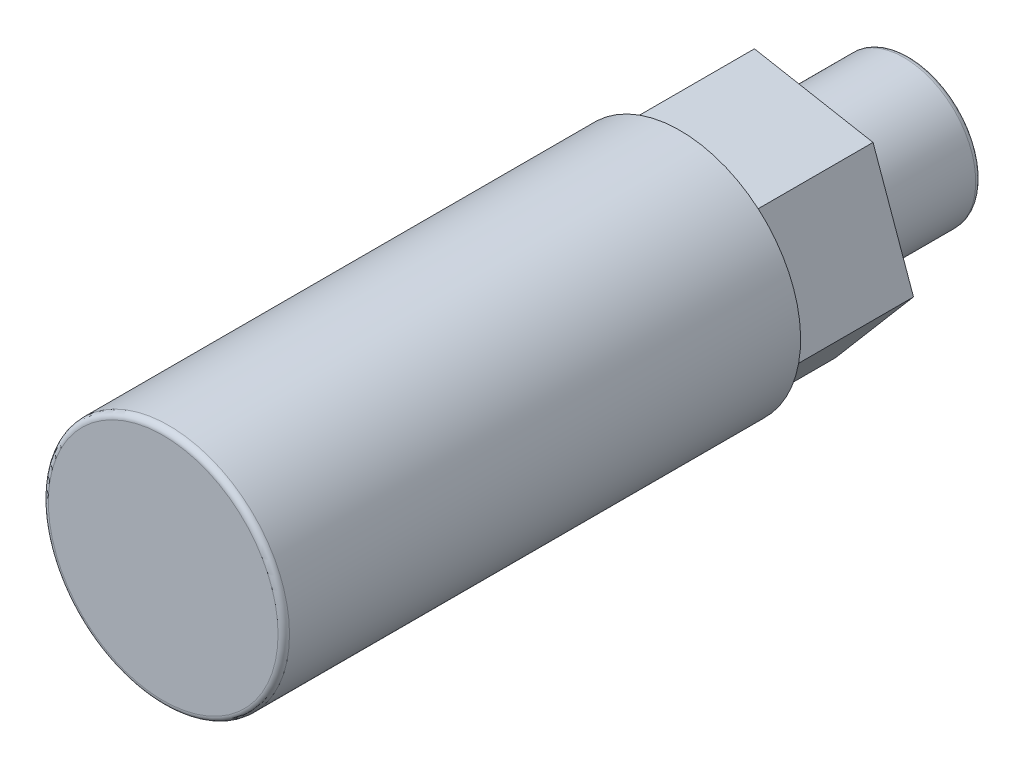
ISO-10303-21;
HEADER;
FILE_DESCRIPTION(('STEP AP214'),'2;1');
FILE_NAME('part.step','',(''),(''),'','','');
FILE_SCHEMA(('AUTOMOTIVE_DESIGN { 1 0 10303 214 1 1 1 1 }'));
ENDSEC;
DATA;
#1=APPLICATION_CONTEXT('core data for automotive mechanical design processes');
#2=APPLICATION_PROTOCOL_DEFINITION('international standard','automotive_design',2000,#1);
#3=PRODUCT_CONTEXT('',#1,'mechanical');
#4=PRODUCT('Part','Part','',(#3));
#5=PRODUCT_RELATED_PRODUCT_CATEGORY('part','',(#4));
#6=PRODUCT_DEFINITION_FORMATION('','',#4);
#7=PRODUCT_DEFINITION_CONTEXT('part definition',#1,'design');
#8=PRODUCT_DEFINITION('design','',#6,#7);
#9=PRODUCT_DEFINITION_SHAPE('','',#8);
#10=(LENGTH_UNIT() NAMED_UNIT(*) SI_UNIT(.MILLI.,.METRE.));
#11=(NAMED_UNIT(*) PLANE_ANGLE_UNIT() SI_UNIT($,.RADIAN.));
#12=(NAMED_UNIT(*) SI_UNIT($,.STERADIAN.) SOLID_ANGLE_UNIT());
#13=UNCERTAINTY_MEASURE_WITH_UNIT(LENGTH_MEASURE(1.E-05),#10,'distance_accuracy_value','');
#14=(GEOMETRIC_REPRESENTATION_CONTEXT(3) GLOBAL_UNCERTAINTY_ASSIGNED_CONTEXT((#13)) GLOBAL_UNIT_ASSIGNED_CONTEXT((#10,
#11,#12)) REPRESENTATION_CONTEXT('',''));
#15=CARTESIAN_POINT('',(0.,0.,0.));
#16=DIRECTION('',(0.,0.,1.));
#17=DIRECTION('',(1.,0.,0.));
#18=AXIS2_PLACEMENT_3D('',#15,#16,#17);
#19=CARTESIAN_POINT('',(-6.80524025575274,-7.99616814864985,-10.));
#20=DIRECTION('',(0.,0.,-1.));
#21=DIRECTION('',(-1.,0.,0.));
#22=AXIS2_PLACEMENT_3D('',#19,#20,#21);
#23=PLANE('',#22);
#24=DIRECTION('',(-0.983571893098964,0.180516844382234,0.));
#25=VECTOR('',#24,1.);
#26=CARTESIAN_POINT('',(3.52226462178638,-9.8915950146633,-10.));
#27=LINE('',#26,#25);
#28=CARTESIAN_POINT('',(3.52226462178638,-9.8915950146633,-10.));
#29=VERTEX_POINT('',#28);
#30=CARTESIAN_POINT('',(-6.80524025575274,-7.99616814864985,-10.));
#31=VERTEX_POINT('',#30);
#32=EDGE_CURVE('E97',#29,#31,#27,.T.);
#33=ORIENTED_EDGE('',*,*,#32,.T.);
#34=DIRECTION('',(-0.335453773503465,0.942056668063172,0.));
#35=VECTOR('',#34,1.);
#36=CARTESIAN_POINT('',(-6.80524025575274,-7.99616814864985,-10.));
#37=LINE('',#36,#35);
#38=CARTESIAN_POINT('',(-10.3275048775391,1.89542686601346,-10.));
#39=VERTEX_POINT('',#38);
#40=EDGE_CURVE('E86',#31,#39,#37,.T.);
#41=ORIENTED_EDGE('',*,*,#40,.T.);
#42=DIRECTION('',(0.648118119595499,0.761539823680938,0.));
#43=VECTOR('',#42,1.);
#44=CARTESIAN_POINT('',(-10.3275048775391,1.89542686601346,-10.));
#45=LINE('',#44,#43);
#46=CARTESIAN_POINT('',(-3.52226462178638,9.8915950146633,-10.));
#47=VERTEX_POINT('',#46);
#48=EDGE_CURVE('E96',#39,#47,#45,.T.);
#49=ORIENTED_EDGE('',*,*,#48,.T.);
#50=DIRECTION('',(0.983571893098964,-0.180516844382234,0.));
#51=VECTOR('',#50,1.);
#52=CARTESIAN_POINT('',(-3.52226462178638,9.8915950146633,-10.));
#53=LINE('',#52,#51);
#54=CARTESIAN_POINT('',(6.80524025575273,7.99616814864985,-10.));
#55=VERTEX_POINT('',#54);
#56=EDGE_CURVE('E209',#47,#55,#53,.T.);
#57=ORIENTED_EDGE('',*,*,#56,.T.);
#58=DIRECTION('',(0.335453773503465,-0.942056668063172,0.));
#59=VECTOR('',#58,1.);
#60=CARTESIAN_POINT('',(6.80524025575273,7.99616814864985,-10.));
#61=LINE('',#60,#59);
#62=CARTESIAN_POINT('',(10.3275048775391,-1.89542686601346,-10.));
#63=VERTEX_POINT('',#62);
#64=EDGE_CURVE('E227',#55,#63,#61,.T.);
#65=ORIENTED_EDGE('',*,*,#64,.T.);
#66=DIRECTION('',(-0.648118119595499,-0.761539823680938,0.));
#67=VECTOR('',#66,1.);
#68=CARTESIAN_POINT('',(10.3275048775391,-1.89542686601346,-10.));
#69=LINE('',#68,#67);
#70=EDGE_CURVE('E102',#63,#29,#69,.T.);
#71=ORIENTED_EDGE('',*,*,#70,.T.);
#72=EDGE_LOOP('',(#33,#41,#49,#57,#65,#71));
#73=FACE_BOUND('',#72,.T.);
#74=CARTESIAN_POINT('',(0.,0.,-10.));
#75=DIRECTION('',(0.,0.,-1.));
#76=DIRECTION('',(-1.,0.,0.));
#77=AXIS2_PLACEMENT_3D('',#74,#75,#76);
#78=CIRCLE('',#77,6.25);
#79=CARTESIAN_POINT('',(-6.25,0.,-10.));
#80=VERTEX_POINT('',#79);
#81=EDGE_CURVE('E225',#80,#80,#78,.T.);
#82=ORIENTED_EDGE('',*,*,#81,.F.);
#83=EDGE_LOOP('',(#82));
#84=FACE_BOUND('',#83,.T.);
#85=ADVANCED_FACE('F32',(#73,#84),#23,.T.);
#86=CARTESIAN_POINT('',(0.,0.,0.));
#87=DIRECTION('',(0.,0.,1.));
#88=DIRECTION('',(1.,0.,0.));
#89=AXIS2_PLACEMENT_3D('',#86,#87,#88);
#90=PLANE('',#89);
#91=DIRECTION('',(-0.983571893098964,0.180516844382234,0.));
#92=VECTOR('',#91,1.);
#93=CARTESIAN_POINT('',(3.52226462178638,-9.8915950146633,0.));
#94=LINE('',#93,#92);
#95=CARTESIAN_POINT('',(3.52226462178637,-9.89159501466331,0.));
#96=VERTEX_POINT('',#95);
#97=CARTESIAN_POINT('',(-6.80524025575273,-7.99616814864986,0.));
#98=VERTEX_POINT('',#97);
#99=EDGE_CURVE('E53',#96,#98,#94,.T.);
#100=ORIENTED_EDGE('',*,*,#99,.F.);
#101=CARTESIAN_POINT('',(0.,0.,0.));
#102=DIRECTION('',(0.,0.,1.));
#103=DIRECTION('',(1.,0.,0.));
#104=AXIS2_PLACEMENT_3D('',#101,#102,#103);
#105=CIRCLE('',#104,10.5);
#106=EDGE_CURVE('E376',#98,#96,#105,.T.);
#107=ORIENTED_EDGE('',*,*,#106,.F.);
#108=EDGE_LOOP('',(#100,#107));
#109=FACE_BOUND('',#108,.T.);
#110=ADVANCED_FACE('F144',(#109),#90,.F.);
#111=DIRECTION('',(-0.648118119595499,-0.761539823680938,0.));
#112=VECTOR('',#111,1.);
#113=CARTESIAN_POINT('',(10.3275048775391,-1.89542686601346,0.));
#114=LINE('',#113,#112);
#115=CARTESIAN_POINT('',(10.3275048775391,-1.89542686601347,0.));
#116=VERTEX_POINT('',#115);
#117=EDGE_CURVE('E46',#116,#96,#114,.T.);
#118=ORIENTED_EDGE('',*,*,#117,.F.);
#119=EDGE_CURVE('E111',#96,#116,#105,.T.);
#120=ORIENTED_EDGE('',*,*,#119,.F.);
#121=EDGE_LOOP('',(#118,#120));
#122=FACE_BOUND('',#121,.T.);
#123=ADVANCED_FACE('F149',(#122),#90,.F.);
#124=DIRECTION('',(0.335453773503465,-0.942056668063172,0.));
#125=VECTOR('',#124,1.);
#126=CARTESIAN_POINT('',(6.80524025575273,7.99616814864985,0.));
#127=LINE('',#126,#125);
#128=CARTESIAN_POINT('',(6.80524025575275,7.99616814864984,0.));
#129=VERTEX_POINT('',#128);
#130=EDGE_CURVE('E219',#129,#116,#127,.T.);
#131=ORIENTED_EDGE('',*,*,#130,.F.);
#132=EDGE_CURVE('E108',#116,#129,#105,.T.);
#133=ORIENTED_EDGE('',*,*,#132,.F.);
#134=EDGE_LOOP('',(#131,#133));
#135=FACE_BOUND('',#134,.T.);
#136=ADVANCED_FACE('F350',(#135),#90,.F.);
#137=DIRECTION('',(0.983571893098964,-0.180516844382234,0.));
#138=VECTOR('',#137,1.);
#139=CARTESIAN_POINT('',(-3.52226462178638,9.8915950146633,0.));
#140=LINE('',#139,#138);
#141=CARTESIAN_POINT('',(-3.52226462178637,9.89159501466331,0.));
#142=VERTEX_POINT('',#141);
#143=EDGE_CURVE('E204',#142,#129,#140,.T.);
#144=ORIENTED_EDGE('',*,*,#143,.F.);
#145=EDGE_CURVE('E113',#129,#142,#105,.T.);
#146=ORIENTED_EDGE('',*,*,#145,.F.);
#147=EDGE_LOOP('',(#144,#146));
#148=FACE_BOUND('',#147,.T.);
#149=ADVANCED_FACE('F342',(#148),#90,.F.);
#150=DIRECTION('',(0.648118119595499,0.761539823680938,0.));
#151=VECTOR('',#150,1.);
#152=CARTESIAN_POINT('',(-10.3275048775391,1.89542686601346,0.));
#153=LINE('',#152,#151);
#154=CARTESIAN_POINT('',(-10.3275048775391,1.89542686601346,0.));
#155=VERTEX_POINT('',#154);
#156=EDGE_CURVE('E200',#155,#142,#153,.T.);
#157=ORIENTED_EDGE('',*,*,#156,.F.);
#158=EDGE_CURVE('E120',#142,#155,#105,.T.);
#159=ORIENTED_EDGE('',*,*,#158,.F.);
#160=EDGE_LOOP('',(#157,#159));
#161=FACE_BOUND('',#160,.T.);
#162=ADVANCED_FACE('F186',(#161),#90,.F.);
#163=DIRECTION('',(-0.335453773503465,0.942056668063172,0.));
#164=VECTOR('',#163,1.);
#165=CARTESIAN_POINT('',(-6.80524025575274,-7.99616814864985,0.));
#166=LINE('',#165,#164);
#167=EDGE_CURVE('E205',#98,#155,#166,.T.);
#168=ORIENTED_EDGE('',*,*,#167,.F.);
#169=EDGE_CURVE('E377',#155,#98,#105,.T.);
#170=ORIENTED_EDGE('',*,*,#169,.F.);
#171=EDGE_LOOP('',(#168,#170));
#172=FACE_BOUND('',#171,.T.);
#173=ADVANCED_FACE('F151',(#172),#90,.F.);
#174=CARTESIAN_POINT('',(0.,0.,45.));
#175=DIRECTION('',(0.,0.,-1.));
#176=DIRECTION('',(-1.,0.,0.));
#177=AXIS2_PLACEMENT_3D('',#174,#175,#176);
#178=CYLINDRICAL_SURFACE('',#177,10.5);
#179=CARTESIAN_POINT('',(0.,0.,44.5));
#180=DIRECTION('',(0.,0.,1.));
#181=DIRECTION('',(1.,0.,0.));
#182=AXIS2_PLACEMENT_3D('',#179,#180,#181);
#183=CIRCLE('',#182,10.5);
#184=CARTESIAN_POINT('',(10.5,0.,44.5));
#185=VERTEX_POINT('',#184);
#186=EDGE_CURVE('E123',#185,#185,#183,.F.);
#187=ORIENTED_EDGE('',*,*,#186,.T.);
#188=EDGE_LOOP('',(#187));
#189=FACE_BOUND('',#188,.T.);
#190=ORIENTED_EDGE('',*,*,#145,.T.);
#191=ORIENTED_EDGE('',*,*,#158,.T.);
#192=ORIENTED_EDGE('',*,*,#169,.T.);
#193=ORIENTED_EDGE('',*,*,#106,.T.);
#194=ORIENTED_EDGE('',*,*,#119,.T.);
#195=ORIENTED_EDGE('',*,*,#132,.T.);
#196=EDGE_LOOP('',(#190,#191,#192,#193,#194,#195));
#197=FACE_BOUND('',#196,.T.);
#198=ADVANCED_FACE('F178',(#189,#197),#178,.T.);
#199=CARTESIAN_POINT('',(0.,0.,45.));
#200=DIRECTION('',(0.,0.,1.));
#201=DIRECTION('',(1.,0.,0.));
#202=AXIS2_PLACEMENT_3D('',#199,#200,#201);
#203=PLANE('',#202);
#204=CARTESIAN_POINT('',(0.,0.,45.));
#205=DIRECTION('',(0.,0.,1.));
#206=DIRECTION('',(1.,0.,0.));
#207=AXIS2_PLACEMENT_3D('',#204,#205,#206);
#208=CIRCLE('',#207,10.);
#209=CARTESIAN_POINT('',(10.,0.,45.));
#210=VERTEX_POINT('',#209);
#211=EDGE_CURVE('E119',#210,#210,#208,.T.);
#212=ORIENTED_EDGE('',*,*,#211,.T.);
#213=EDGE_LOOP('',(#212));
#214=FACE_BOUND('',#213,.T.);
#215=ADVANCED_FACE('F176',(#214),#203,.T.);
#216=CARTESIAN_POINT('',(3.52226462178638,-9.8915950146633,-10.));
#217=DIRECTION('',(0.180516844382234,0.983571893098964,0.));
#218=DIRECTION('',(-0.983571893098964,0.180516844382234,0.));
#219=AXIS2_PLACEMENT_3D('',#216,#217,#218);
#220=PLANE('',#219);
#221=ORIENTED_EDGE('',*,*,#99,.T.);
#222=DIRECTION('',(0.,0.,1.));
#223=VECTOR('',#222,1.);
#224=CARTESIAN_POINT('',(-6.80524025575274,-7.99616814864985,-10.));
#225=LINE('',#224,#223);
#226=EDGE_CURVE('E91',#31,#98,#225,.T.);
#227=ORIENTED_EDGE('',*,*,#226,.F.);
#228=ORIENTED_EDGE('',*,*,#32,.F.);
#229=DIRECTION('',(0.,0.,1.));
#230=VECTOR('',#229,1.);
#231=CARTESIAN_POINT('',(3.52226462178638,-9.8915950146633,-10.));
#232=LINE('',#231,#230);
#233=EDGE_CURVE('E216',#29,#96,#232,.T.);
#234=ORIENTED_EDGE('',*,*,#233,.T.);
#235=EDGE_LOOP('',(#221,#227,#228,#234));
#236=FACE_BOUND('',#235,.T.);
#237=ADVANCED_FACE('F107',(#236),#220,.F.);
#238=CARTESIAN_POINT('',(-6.80524025575274,-7.99616814864985,-10.));
#239=DIRECTION('',(0.942056668063172,0.335453773503465,0.));
#240=DIRECTION('',(-0.335453773503465,0.942056668063172,0.));
#241=AXIS2_PLACEMENT_3D('',#238,#239,#240);
#242=PLANE('',#241);
#243=ORIENTED_EDGE('',*,*,#167,.T.);
#244=DIRECTION('',(0.,0.,1.));
#245=VECTOR('',#244,1.);
#246=CARTESIAN_POINT('',(-10.3275048775391,1.89542686601346,-10.));
#247=LINE('',#246,#245);
#248=EDGE_CURVE('E93',#39,#155,#247,.T.);
#249=ORIENTED_EDGE('',*,*,#248,.F.);
#250=ORIENTED_EDGE('',*,*,#40,.F.);
#251=ORIENTED_EDGE('',*,*,#226,.T.);
#252=EDGE_LOOP('',(#243,#249,#250,#251));
#253=FACE_BOUND('',#252,.T.);
#254=ADVANCED_FACE('F89',(#253),#242,.F.);
#255=CARTESIAN_POINT('',(-10.3275048775391,1.89542686601346,-10.));
#256=DIRECTION('',(0.761539823680938,-0.648118119595499,0.));
#257=DIRECTION('',(0.648118119595499,0.761539823680938,0.));
#258=AXIS2_PLACEMENT_3D('',#255,#256,#257);
#259=PLANE('',#258);
#260=ORIENTED_EDGE('',*,*,#156,.T.);
#261=DIRECTION('',(0.,0.,1.));
#262=VECTOR('',#261,1.);
#263=CARTESIAN_POINT('',(-3.52226462178638,9.8915950146633,-10.));
#264=LINE('',#263,#262);
#265=EDGE_CURVE('E114',#47,#142,#264,.T.);
#266=ORIENTED_EDGE('',*,*,#265,.F.);
#267=ORIENTED_EDGE('',*,*,#48,.F.);
#268=ORIENTED_EDGE('',*,*,#248,.T.);
#269=EDGE_LOOP('',(#260,#266,#267,#268));
#270=FACE_BOUND('',#269,.T.);
#271=ADVANCED_FACE('F167',(#270),#259,.F.);
#272=CARTESIAN_POINT('',(-3.52226462178638,9.8915950146633,-10.));
#273=DIRECTION('',(-0.180516844382234,-0.983571893098964,0.));
#274=DIRECTION('',(0.983571893098964,-0.180516844382234,0.));
#275=AXIS2_PLACEMENT_3D('',#272,#273,#274);
#276=PLANE('',#275);
#277=ORIENTED_EDGE('',*,*,#143,.T.);
#278=DIRECTION('',(0.,0.,1.));
#279=VECTOR('',#278,1.);
#280=CARTESIAN_POINT('',(6.80524025575273,7.99616814864985,-10.));
#281=LINE('',#280,#279);
#282=EDGE_CURVE('E210',#55,#129,#281,.T.);
#283=ORIENTED_EDGE('',*,*,#282,.F.);
#284=ORIENTED_EDGE('',*,*,#56,.F.);
#285=ORIENTED_EDGE('',*,*,#265,.T.);
#286=EDGE_LOOP('',(#277,#283,#284,#285));
#287=FACE_BOUND('',#286,.T.);
#288=ADVANCED_FACE('F163',(#287),#276,.F.);
#289=CARTESIAN_POINT('',(6.80524025575273,7.99616814864985,-10.));
#290=DIRECTION('',(-0.942056668063172,-0.335453773503465,0.));
#291=DIRECTION('',(0.335453773503465,-0.942056668063172,0.));
#292=AXIS2_PLACEMENT_3D('',#289,#290,#291);
#293=PLANE('',#292);
#294=ORIENTED_EDGE('',*,*,#130,.T.);
#295=DIRECTION('',(0.,0.,1.));
#296=VECTOR('',#295,1.);
#297=CARTESIAN_POINT('',(10.3275048775391,-1.89542686601346,-10.));
#298=LINE('',#297,#296);
#299=EDGE_CURVE('E211',#63,#116,#298,.T.);
#300=ORIENTED_EDGE('',*,*,#299,.F.);
#301=ORIENTED_EDGE('',*,*,#64,.F.);
#302=ORIENTED_EDGE('',*,*,#282,.T.);
#303=EDGE_LOOP('',(#294,#300,#301,#302));
#304=FACE_BOUND('',#303,.T.);
#305=ADVANCED_FACE('F159',(#304),#293,.F.);
#306=CARTESIAN_POINT('',(10.3275048775391,-1.89542686601346,-10.));
#307=DIRECTION('',(-0.761539823680938,0.648118119595499,0.));
#308=DIRECTION('',(-0.648118119595499,-0.761539823680938,0.));
#309=AXIS2_PLACEMENT_3D('',#306,#307,#308);
#310=PLANE('',#309);
#311=ORIENTED_EDGE('',*,*,#117,.T.);
#312=ORIENTED_EDGE('',*,*,#233,.F.);
#313=ORIENTED_EDGE('',*,*,#70,.F.);
#314=ORIENTED_EDGE('',*,*,#299,.T.);
#315=EDGE_LOOP('',(#311,#312,#313,#314));
#316=FACE_BOUND('',#315,.T.);
#317=ADVANCED_FACE('F156',(#316),#310,.F.);
#318=CARTESIAN_POINT('',(0.,0.,-20.));
#319=DIRECTION('',(0.,0.,1.));
#320=DIRECTION('',(1.,0.,0.));
#321=AXIS2_PLACEMENT_3D('',#318,#319,#320);
#322=CYLINDRICAL_SURFACE('',#321,6.25);
#323=CARTESIAN_POINT('',(0.,0.,-19.5));
#324=DIRECTION('',(0.,0.,-1.));
#325=DIRECTION('',(-1.,0.,0.));
#326=AXIS2_PLACEMENT_3D('',#323,#324,#325);
#327=CIRCLE('',#326,6.25);
#328=CARTESIAN_POINT('',(-6.25,0.,-19.5));
#329=VERTEX_POINT('',#328);
#330=EDGE_CURVE('E11',#329,#329,#327,.F.);
#331=ORIENTED_EDGE('',*,*,#330,.T.);
#332=EDGE_LOOP('',(#331));
#333=FACE_BOUND('',#332,.T.);
#334=ORIENTED_EDGE('',*,*,#81,.T.);
#335=EDGE_LOOP('',(#334));
#336=FACE_BOUND('',#335,.T.);
#337=ADVANCED_FACE('F154',(#333,#336),#322,.T.);
#338=CARTESIAN_POINT('',(0.,0.,-20.));
#339=DIRECTION('',(0.,0.,-1.));
#340=DIRECTION('',(-1.,0.,0.));
#341=AXIS2_PLACEMENT_3D('',#338,#339,#340);
#342=PLANE('',#341);
#343=CARTESIAN_POINT('',(0.,0.,-20.));
#344=DIRECTION('',(0.,0.,-1.));
#345=DIRECTION('',(-1.,0.,0.));
#346=AXIS2_PLACEMENT_3D('',#343,#344,#345);
#347=CIRCLE('',#346,3.90507370707199);
#348=CARTESIAN_POINT('',(-3.90507370707199,0.,-20.));
#349=VERTEX_POINT('',#348);
#350=EDGE_CURVE('E234',#349,#349,#347,.T.);
#351=ORIENTED_EDGE('',*,*,#350,.F.);
#352=EDGE_LOOP('',(#351));
#353=FACE_BOUND('',#352,.T.);
#354=CARTESIAN_POINT('',(0.,0.,-20.));
#355=DIRECTION('',(0.,0.,-1.));
#356=DIRECTION('',(-1.,0.,0.));
#357=AXIS2_PLACEMENT_3D('',#354,#355,#356);
#358=CIRCLE('',#357,5.75);
#359=CARTESIAN_POINT('',(-5.75,0.,-20.));
#360=VERTEX_POINT('',#359);
#361=EDGE_CURVE('E40',#360,#360,#358,.T.);
#362=ORIENTED_EDGE('',*,*,#361,.T.);
#363=EDGE_LOOP('',(#362));
#364=FACE_BOUND('',#363,.T.);
#365=ADVANCED_FACE('F128',(#353,#364),#342,.T.);
#366=CARTESIAN_POINT('',(0.,0.,44.5));
#367=DIRECTION('',(0.,0.,1.));
#368=DIRECTION('',(1.,0.,0.));
#369=AXIS2_PLACEMENT_3D('',#366,#367,#368);
#370=TOROIDAL_SURFACE('',#369,10.,0.5);
#371=ORIENTED_EDGE('',*,*,#186,.F.);
#372=EDGE_LOOP('',(#371));
#373=FACE_BOUND('',#372,.T.);
#374=ORIENTED_EDGE('',*,*,#211,.F.);
#375=EDGE_LOOP('',(#374));
#376=FACE_BOUND('',#375,.T.);
#377=ADVANCED_FACE('F132',(#373,#376),#370,.T.);
#378=CARTESIAN_POINT('',(0.,0.,-19.5));
#379=DIRECTION('',(0.,0.,-1.));
#380=DIRECTION('',(-1.,0.,0.));
#381=AXIS2_PLACEMENT_3D('',#378,#379,#380);
#382=TOROIDAL_SURFACE('',#381,5.75,0.5);
#383=ORIENTED_EDGE('',*,*,#330,.F.);
#384=EDGE_LOOP('',(#383));
#385=FACE_BOUND('',#384,.T.);
#386=ORIENTED_EDGE('',*,*,#361,.F.);
#387=EDGE_LOOP('',(#386));
#388=FACE_BOUND('',#387,.T.);
#389=ADVANCED_FACE('F34',(#385,#388),#382,.T.);
#390=CARTESIAN_POINT('',(0.,0.,40.));
#391=DIRECTION('',(0.,0.,-1.));
#392=DIRECTION('',(-1.,0.,0.));
#393=AXIS2_PLACEMENT_3D('',#390,#391,#392);
#394=CYLINDRICAL_SURFACE('',#393,3.90507370707199);
#395=CARTESIAN_POINT('',(0.,0.,40.));
#396=DIRECTION('',(0.,0.,-1.));
#397=DIRECTION('',(-1.,0.,0.));
#398=AXIS2_PLACEMENT_3D('',#395,#396,#397);
#399=CIRCLE('',#398,3.90507370707199);
#400=CARTESIAN_POINT('',(-3.90507370707199,0.,40.));
#401=VERTEX_POINT('',#400);
#402=EDGE_CURVE('E233',#401,#401,#399,.T.);
#403=ORIENTED_EDGE('',*,*,#402,.F.);
#404=EDGE_LOOP('',(#403));
#405=FACE_BOUND('',#404,.T.);
#406=ORIENTED_EDGE('',*,*,#350,.T.);
#407=EDGE_LOOP('',(#406));
#408=FACE_BOUND('',#407,.T.);
#409=ADVANCED_FACE('F131',(#405,#408),#394,.F.);
#410=CARTESIAN_POINT('',(0.,0.,40.));
#411=DIRECTION('',(0.,0.,-1.));
#412=DIRECTION('',(-1.,0.,0.));
#413=AXIS2_PLACEMENT_3D('',#410,#411,#412);
#414=PLANE('',#413);
#415=ORIENTED_EDGE('',*,*,#402,.T.);
#416=EDGE_LOOP('',(#415));
#417=FACE_BOUND('',#416,.T.);
#418=ADVANCED_FACE('F138',(#417),#414,.T.);
#419=CLOSED_SHELL('',(#85,#110,#123,#136,#149,#162,#173,#198,#215,#237,#254,#271,#288,#305,#317,
#337,#365,#377,#389,#409,#418));
#420=MANIFOLD_SOLID_BREP('B2',#419);
#421=ADVANCED_BREP_SHAPE_REPRESENTATION('',(#18,#420),#14);
#422=SHAPE_DEFINITION_REPRESENTATION(#9,#421);
ENDSEC;
END-ISO-10303-21;
